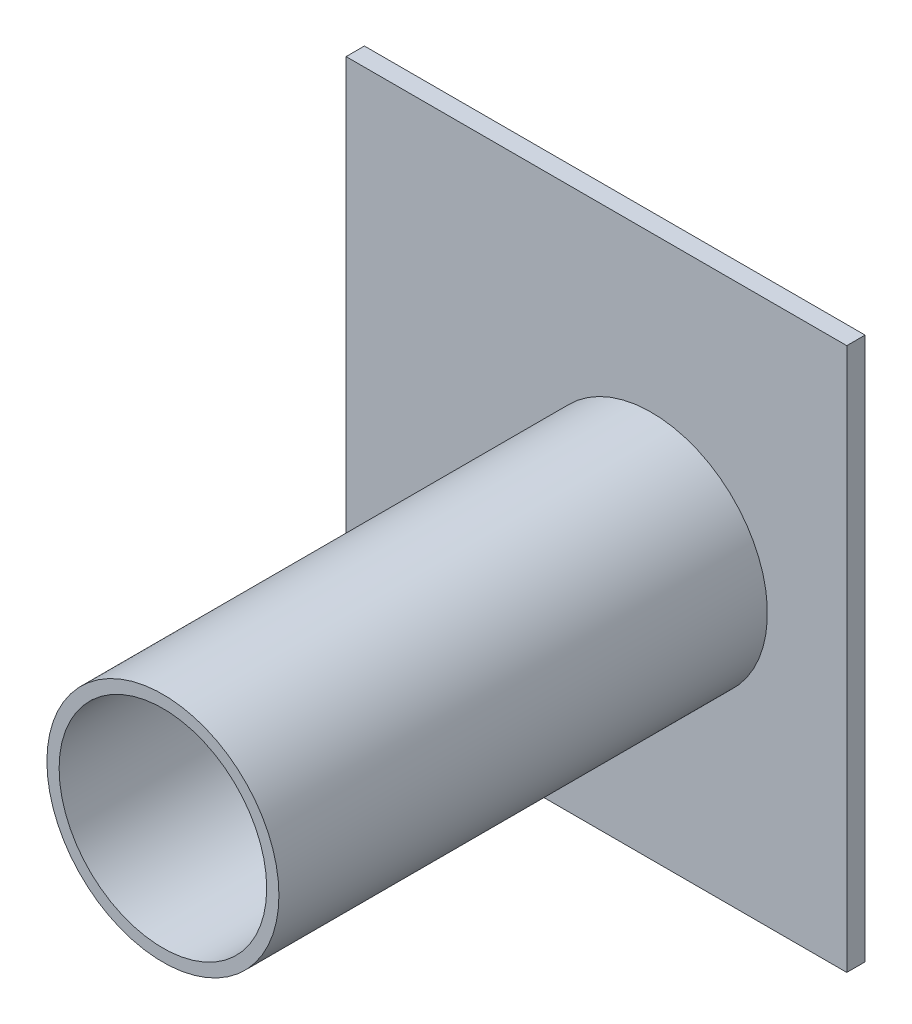
ISO-10303-21;
HEADER;
FILE_DESCRIPTION(('STEP AP214'),'2;1');
FILE_NAME('part.step','',(''),(''),'','','');
FILE_SCHEMA(('AUTOMOTIVE_DESIGN { 1 0 10303 214 1 1 1 1 }'));
ENDSEC;
DATA;
#1=APPLICATION_CONTEXT('core data for automotive mechanical design processes');
#2=APPLICATION_PROTOCOL_DEFINITION('international standard','automotive_design',2000,#1);
#3=PRODUCT_CONTEXT('',#1,'mechanical');
#4=PRODUCT('Part','Part','',(#3));
#5=PRODUCT_RELATED_PRODUCT_CATEGORY('part','',(#4));
#6=PRODUCT_DEFINITION_FORMATION('','',#4);
#7=PRODUCT_DEFINITION_CONTEXT('part definition',#1,'design');
#8=PRODUCT_DEFINITION('design','',#6,#7);
#9=PRODUCT_DEFINITION_SHAPE('','',#8);
#10=(LENGTH_UNIT() NAMED_UNIT(*) SI_UNIT(.MILLI.,.METRE.));
#11=(NAMED_UNIT(*) PLANE_ANGLE_UNIT() SI_UNIT($,.RADIAN.));
#12=(NAMED_UNIT(*) SI_UNIT($,.STERADIAN.) SOLID_ANGLE_UNIT());
#13=UNCERTAINTY_MEASURE_WITH_UNIT(LENGTH_MEASURE(1.E-05),#10,'distance_accuracy_value','');
#14=(GEOMETRIC_REPRESENTATION_CONTEXT(3) GLOBAL_UNCERTAINTY_ASSIGNED_CONTEXT((#13)) GLOBAL_UNIT_ASSIGNED_CONTEXT((#10,
#11,#12)) REPRESENTATION_CONTEXT('',''));
#15=CARTESIAN_POINT('',(0.,0.,0.));
#16=DIRECTION('',(0.,0.,1.));
#17=DIRECTION('',(1.,0.,0.));
#18=AXIS2_PLACEMENT_3D('',#15,#16,#17);
#19=CARTESIAN_POINT('',(0.,0.,3.));
#20=DIRECTION('',(0.,0.,-1.));
#21=DIRECTION('',(-1.,0.,0.));
#22=AXIS2_PLACEMENT_3D('',#19,#20,#21);
#23=PLANE('',#22);
#24=DIRECTION('',(0.,-1.,0.));
#25=VECTOR('',#24,1.);
#26=CARTESIAN_POINT('',(-50.,-44.45,3.));
#27=LINE('',#26,#25);
#28=CARTESIAN_POINT('',(-50.,44.45,3.));
#29=VERTEX_POINT('',#28);
#30=CARTESIAN_POINT('',(-50.,-44.45,3.));
#31=VERTEX_POINT('',#30);
#32=EDGE_CURVE('E87',#29,#31,#27,.T.);
#33=ORIENTED_EDGE('',*,*,#32,.T.);
#34=DIRECTION('',(1.,0.,0.));
#35=VECTOR('',#34,1.);
#36=CARTESIAN_POINT('',(-50.,-44.45,3.));
#37=LINE('',#36,#35);
#38=CARTESIAN_POINT('',(32.,-44.45,3.));
#39=VERTEX_POINT('',#38);
#40=EDGE_CURVE('E82',#31,#39,#37,.T.);
#41=ORIENTED_EDGE('',*,*,#40,.T.);
#42=DIRECTION('',(0.,1.,0.));
#43=VECTOR('',#42,1.);
#44=CARTESIAN_POINT('',(32.,44.45,3.));
#45=LINE('',#44,#43);
#46=CARTESIAN_POINT('',(32.,44.45,3.));
#47=VERTEX_POINT('',#46);
#48=EDGE_CURVE('E85',#39,#47,#45,.T.);
#49=ORIENTED_EDGE('',*,*,#48,.T.);
#50=DIRECTION('',(-1.,0.,0.));
#51=VECTOR('',#50,1.);
#52=CARTESIAN_POINT('',(-50.,44.45,3.));
#53=LINE('',#52,#51);
#54=EDGE_CURVE('E51',#47,#29,#53,.T.);
#55=ORIENTED_EDGE('',*,*,#54,.T.);
#56=EDGE_LOOP('',(#33,#41,#49,#55));
#57=FACE_BOUND('',#56,.T.);
#58=CARTESIAN_POINT('',(0.,0.,3.));
#59=DIRECTION('',(0.,0.,-1.));
#60=DIRECTION('',(-1.,0.,0.));
#61=AXIS2_PLACEMENT_3D('',#58,#59,#60);
#62=CIRCLE('',#61,19.);
#63=CARTESIAN_POINT('',(-19.,0.,3.));
#64=VERTEX_POINT('',#63);
#65=EDGE_CURVE('E11',#64,#64,#62,.F.);
#66=ORIENTED_EDGE('',*,*,#65,.F.);
#67=EDGE_LOOP('',(#66));
#68=FACE_BOUND('',#67,.T.);
#69=ADVANCED_FACE('F34',(#57,#68),#23,.F.);
#70=CARTESIAN_POINT('',(0.,0.,0.));
#71=DIRECTION('',(0.,0.,-1.));
#72=DIRECTION('',(-1.,0.,0.));
#73=AXIS2_PLACEMENT_3D('',#70,#71,#72);
#74=PLANE('',#73);
#75=DIRECTION('',(0.,-1.,0.));
#76=VECTOR('',#75,1.);
#77=CARTESIAN_POINT('',(-50.,-44.45,0.));
#78=LINE('',#77,#76);
#79=CARTESIAN_POINT('',(-50.,44.45,0.));
#80=VERTEX_POINT('',#79);
#81=CARTESIAN_POINT('',(-50.,-44.45,0.));
#82=VERTEX_POINT('',#81);
#83=EDGE_CURVE('E101',#80,#82,#78,.T.);
#84=ORIENTED_EDGE('',*,*,#83,.F.);
#85=DIRECTION('',(-1.,0.,0.));
#86=VECTOR('',#85,1.);
#87=CARTESIAN_POINT('',(-50.,44.45,0.));
#88=LINE('',#87,#86);
#89=CARTESIAN_POINT('',(32.,44.45,0.));
#90=VERTEX_POINT('',#89);
#91=EDGE_CURVE('E74',#90,#80,#88,.T.);
#92=ORIENTED_EDGE('',*,*,#91,.F.);
#93=DIRECTION('',(0.,1.,0.));
#94=VECTOR('',#93,1.);
#95=CARTESIAN_POINT('',(32.,44.45,0.));
#96=LINE('',#95,#94);
#97=CARTESIAN_POINT('',(32.,-44.45,0.));
#98=VERTEX_POINT('',#97);
#99=EDGE_CURVE('E68',#98,#90,#96,.T.);
#100=ORIENTED_EDGE('',*,*,#99,.F.);
#101=DIRECTION('',(1.,0.,0.));
#102=VECTOR('',#101,1.);
#103=CARTESIAN_POINT('',(0.,-44.45,0.));
#104=LINE('',#103,#102);
#105=EDGE_CURVE('E92',#82,#98,#104,.T.);
#106=ORIENTED_EDGE('',*,*,#105,.F.);
#107=EDGE_LOOP('',(#84,#92,#100,#106));
#108=FACE_BOUND('',#107,.T.);
#109=CARTESIAN_POINT('',(0.,0.,0.));
#110=DIRECTION('',(0.,0.,1.));
#111=DIRECTION('',(1.,0.,0.));
#112=AXIS2_PLACEMENT_3D('',#109,#110,#111);
#113=CIRCLE('',#112,17.);
#114=CARTESIAN_POINT('',(17.,0.,0.));
#115=VERTEX_POINT('',#114);
#116=EDGE_CURVE('E104',#115,#115,#113,.T.);
#117=ORIENTED_EDGE('',*,*,#116,.T.);
#118=EDGE_LOOP('',(#117));
#119=FACE_BOUND('',#118,.T.);
#120=ADVANCED_FACE('F112',(#108,#119),#74,.T.);
#121=CARTESIAN_POINT('',(-50.,-44.45,3.));
#122=DIRECTION('',(1.,0.,0.));
#123=DIRECTION('',(0.,0.,-1.));
#124=AXIS2_PLACEMENT_3D('',#121,#122,#123);
#125=PLANE('',#124);
#126=ORIENTED_EDGE('',*,*,#83,.T.);
#127=DIRECTION('',(0.,0.,-1.));
#128=VECTOR('',#127,1.);
#129=CARTESIAN_POINT('',(-50.,-44.45,3.));
#130=LINE('',#129,#128);
#131=EDGE_CURVE('E43',#31,#82,#130,.T.);
#132=ORIENTED_EDGE('',*,*,#131,.F.);
#133=ORIENTED_EDGE('',*,*,#32,.F.);
#134=DIRECTION('',(0.,0.,-1.));
#135=VECTOR('',#134,1.);
#136=CARTESIAN_POINT('',(-50.,44.45,3.));
#137=LINE('',#136,#135);
#138=EDGE_CURVE('E97',#29,#80,#137,.T.);
#139=ORIENTED_EDGE('',*,*,#138,.T.);
#140=EDGE_LOOP('',(#126,#132,#133,#139));
#141=FACE_BOUND('',#140,.T.);
#142=ADVANCED_FACE('F36',(#141),#125,.F.);
#143=CARTESIAN_POINT('',(0.,-44.45,3.));
#144=DIRECTION('',(0.,1.,0.));
#145=DIRECTION('',(-1.,0.,0.));
#146=AXIS2_PLACEMENT_3D('',#143,#144,#145);
#147=PLANE('',#146);
#148=ORIENTED_EDGE('',*,*,#105,.T.);
#149=DIRECTION('',(0.,0.,-1.));
#150=VECTOR('',#149,1.);
#151=CARTESIAN_POINT('',(32.,-44.45,3.));
#152=LINE('',#151,#150);
#153=EDGE_CURVE('E90',#39,#98,#152,.T.);
#154=ORIENTED_EDGE('',*,*,#153,.F.);
#155=ORIENTED_EDGE('',*,*,#40,.F.);
#156=ORIENTED_EDGE('',*,*,#131,.T.);
#157=EDGE_LOOP('',(#148,#154,#155,#156));
#158=FACE_BOUND('',#157,.T.);
#159=ADVANCED_FACE('F91',(#158),#147,.F.);
#160=CARTESIAN_POINT('',(32.,44.45,3.));
#161=DIRECTION('',(-1.,0.,0.));
#162=DIRECTION('',(0.,0.,1.));
#163=AXIS2_PLACEMENT_3D('',#160,#161,#162);
#164=PLANE('',#163);
#165=ORIENTED_EDGE('',*,*,#99,.T.);
#166=DIRECTION('',(0.,0.,-1.));
#167=VECTOR('',#166,1.);
#168=CARTESIAN_POINT('',(32.,44.45,3.));
#169=LINE('',#168,#167);
#170=EDGE_CURVE('E93',#47,#90,#169,.T.);
#171=ORIENTED_EDGE('',*,*,#170,.F.);
#172=ORIENTED_EDGE('',*,*,#48,.F.);
#173=ORIENTED_EDGE('',*,*,#153,.T.);
#174=EDGE_LOOP('',(#165,#171,#172,#173));
#175=FACE_BOUND('',#174,.T.);
#176=ADVANCED_FACE('F95',(#175),#164,.F.);
#177=CARTESIAN_POINT('',(-50.,44.45,3.));
#178=DIRECTION('',(0.,-1.,0.));
#179=DIRECTION('',(1.,0.,0.));
#180=AXIS2_PLACEMENT_3D('',#177,#178,#179);
#181=PLANE('',#180);
#182=ORIENTED_EDGE('',*,*,#91,.T.);
#183=ORIENTED_EDGE('',*,*,#138,.F.);
#184=ORIENTED_EDGE('',*,*,#54,.F.);
#185=ORIENTED_EDGE('',*,*,#170,.T.);
#186=EDGE_LOOP('',(#182,#183,#184,#185));
#187=FACE_BOUND('',#186,.T.);
#188=ADVANCED_FACE('F141',(#187),#181,.F.);
#189=CARTESIAN_POINT('',(0.,0.,3.));
#190=DIRECTION('',(0.,0.,-1.));
#191=DIRECTION('',(-1.,0.,0.));
#192=AXIS2_PLACEMENT_3D('',#189,#190,#191);
#193=CYLINDRICAL_SURFACE('',#192,17.);
#194=ORIENTED_EDGE('',*,*,#116,.F.);
#195=EDGE_LOOP('',(#194));
#196=FACE_BOUND('',#195,.T.);
#197=CARTESIAN_POINT('',(0.,0.,83.));
#198=DIRECTION('',(0.,0.,1.));
#199=DIRECTION('',(1.,0.,0.));
#200=AXIS2_PLACEMENT_3D('',#197,#198,#199);
#201=CIRCLE('',#200,17.);
#202=CARTESIAN_POINT('',(17.,0.,83.));
#203=VERTEX_POINT('',#202);
#204=EDGE_CURVE('E122',#203,#203,#201,.T.);
#205=ORIENTED_EDGE('',*,*,#204,.T.);
#206=EDGE_LOOP('',(#205));
#207=FACE_BOUND('',#206,.T.);
#208=ADVANCED_FACE('F128',(#196,#207),#193,.F.);
#209=CARTESIAN_POINT('',(0.,0.,83.));
#210=DIRECTION('',(0.,0.,1.));
#211=DIRECTION('',(1.,0.,0.));
#212=AXIS2_PLACEMENT_3D('',#209,#210,#211);
#213=PLANE('',#212);
#214=CARTESIAN_POINT('',(0.,0.,83.));
#215=DIRECTION('',(0.,0.,1.));
#216=DIRECTION('',(1.,0.,0.));
#217=AXIS2_PLACEMENT_3D('',#214,#215,#216);
#218=CIRCLE('',#217,19.);
#219=CARTESIAN_POINT('',(19.,0.,83.));
#220=VERTEX_POINT('',#219);
#221=EDGE_CURVE('E119',#220,#220,#218,.T.);
#222=ORIENTED_EDGE('',*,*,#221,.T.);
#223=EDGE_LOOP('',(#222));
#224=FACE_BOUND('',#223,.T.);
#225=ORIENTED_EDGE('',*,*,#204,.F.);
#226=EDGE_LOOP('',(#225));
#227=FACE_BOUND('',#226,.T.);
#228=ADVANCED_FACE('F130',(#224,#227),#213,.T.);
#229=CARTESIAN_POINT('',(0.,0.,83.));
#230=DIRECTION('',(0.,0.,-1.));
#231=DIRECTION('',(-1.,0.,0.));
#232=AXIS2_PLACEMENT_3D('',#229,#230,#231);
#233=CYLINDRICAL_SURFACE('',#232,19.);
#234=ORIENTED_EDGE('',*,*,#221,.F.);
#235=EDGE_LOOP('',(#234));
#236=FACE_BOUND('',#235,.T.);
#237=ORIENTED_EDGE('',*,*,#65,.T.);
#238=EDGE_LOOP('',(#237));
#239=FACE_BOUND('',#238,.T.);
#240=ADVANCED_FACE('F132',(#236,#239),#233,.T.);
#241=CLOSED_SHELL('',(#69,#120,#142,#159,#176,#188,#208,#228,#240));
#242=MANIFOLD_SOLID_BREP('B2',#241);
#243=ADVANCED_BREP_SHAPE_REPRESENTATION('',(#18,#242),#14);
#244=SHAPE_DEFINITION_REPRESENTATION(#9,#243);
ENDSEC;
END-ISO-10303-21;
